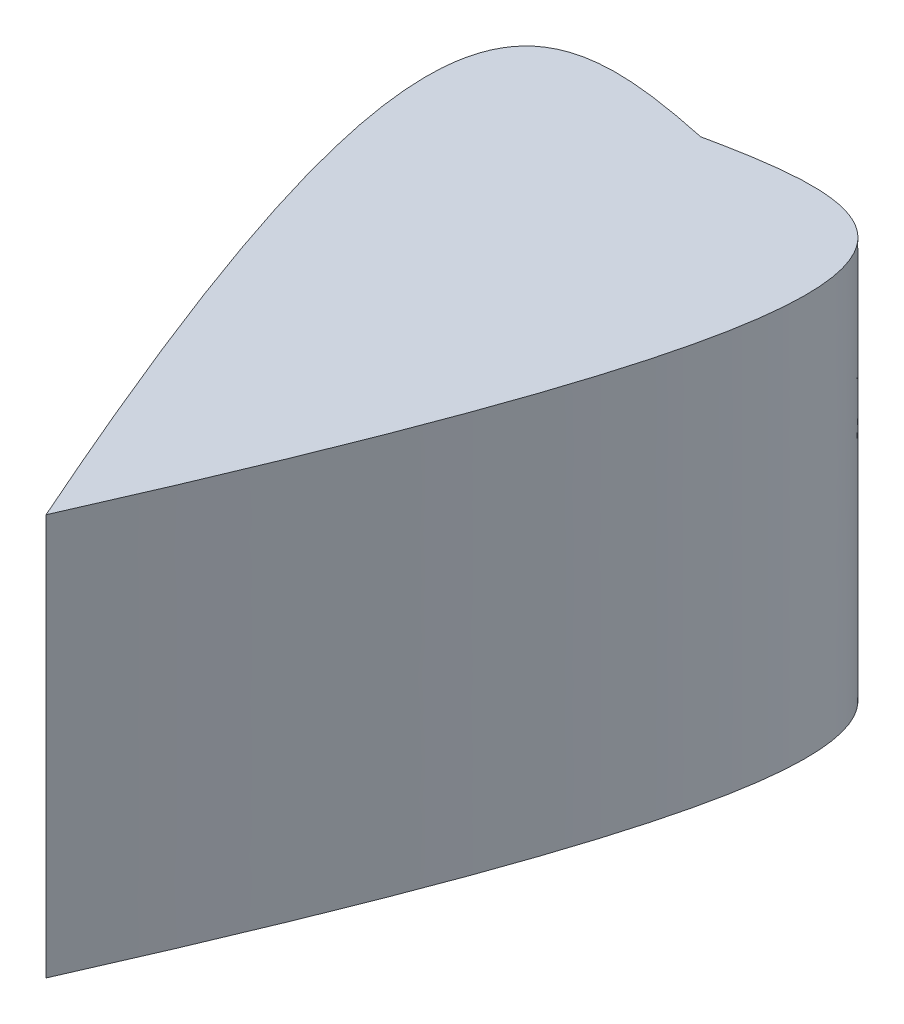
ISO-10303-21;
HEADER;
FILE_DESCRIPTION(('STEP AP214'),'2;1');
FILE_NAME('part.step','',(''),(''),'','','');
FILE_SCHEMA(('AUTOMOTIVE_DESIGN { 1 0 10303 214 1 1 1 1 }'));
ENDSEC;
DATA;
#1=APPLICATION_CONTEXT('core data for automotive mechanical design processes');
#2=APPLICATION_PROTOCOL_DEFINITION('international standard','automotive_design',2000,#1);
#3=PRODUCT_CONTEXT('',#1,'mechanical');
#4=PRODUCT('Part','Part','',(#3));
#5=PRODUCT_RELATED_PRODUCT_CATEGORY('part','',(#4));
#6=PRODUCT_DEFINITION_FORMATION('','',#4);
#7=PRODUCT_DEFINITION_CONTEXT('part definition',#1,'design');
#8=PRODUCT_DEFINITION('design','',#6,#7);
#9=PRODUCT_DEFINITION_SHAPE('','',#8);
#10=(LENGTH_UNIT() NAMED_UNIT(*) SI_UNIT(.MILLI.,.METRE.));
#11=(NAMED_UNIT(*) PLANE_ANGLE_UNIT() SI_UNIT($,.RADIAN.));
#12=(NAMED_UNIT(*) SI_UNIT($,.STERADIAN.) SOLID_ANGLE_UNIT());
#13=UNCERTAINTY_MEASURE_WITH_UNIT(LENGTH_MEASURE(1.E-05),#10,'distance_accuracy_value','');
#14=(GEOMETRIC_REPRESENTATION_CONTEXT(3) GLOBAL_UNCERTAINTY_ASSIGNED_CONTEXT((#13)) GLOBAL_UNIT_ASSIGNED_CONTEXT((#10,
#11,#12)) REPRESENTATION_CONTEXT('',''));
#15=CARTESIAN_POINT('',(0.,0.,0.));
#16=DIRECTION('',(0.,0.,1.));
#17=DIRECTION('',(1.,0.,0.));
#18=AXIS2_PLACEMENT_3D('',#15,#16,#17);
#19=CARTESIAN_POINT('',(127.864614933596,1007.76905578339,1926.66056876298));
#20=CARTESIAN_POINT('',(-74.2746646403005,1007.76905578339,1883.7763724246));
#21=CARTESIAN_POINT('',(-169.46139322895,1007.76905578339,1907.41005327295));
#22=CARTESIAN_POINT('',(127.864614933596,1007.76905578339,2579.34949617285));
#23=B_SPLINE_CURVE_WITH_KNOTS('',3,(#19,#20,#21,#22),.UNSPECIFIED.,.F.,.F.,(4,4),(0.,1.),.UNSPECIFIED.);
#24=DIRECTION('',(0.,-1.,0.));
#25=VECTOR('',#24,1.);
#26=SURFACE_OF_LINEAR_EXTRUSION('',#23,#25);
#27=CARTESIAN_POINT('',(127.864614933596,607.769055783391,1926.66056876298));
#28=CARTESIAN_POINT('',(-74.2746646403005,607.769055783391,1883.7763724246));
#29=CARTESIAN_POINT('',(-169.46139322895,607.769055783391,1907.41005327295));
#30=CARTESIAN_POINT('',(127.864614933596,607.769055783391,2579.34949617285));
#31=B_SPLINE_CURVE_WITH_KNOTS('',3,(#27,#28,#29,#30),.UNSPECIFIED.,.F.,.F.,(4,4),(0.,1.),.UNSPECIFIED.);
#32=CARTESIAN_POINT('',(127.864614933596,607.769055783391,1926.66056876298));
#33=VERTEX_POINT('',#32);
#34=CARTESIAN_POINT('',(127.864614933596,607.769055783391,2579.34949617285));
#35=VERTEX_POINT('',#34);
#36=EDGE_CURVE('E69',#33,#35,#31,.T.);
#37=ORIENTED_EDGE('',*,*,#36,.T.);
#38=DIRECTION('',(0.,-1.,0.));
#39=VECTOR('',#38,1.);
#40=CARTESIAN_POINT('',(127.864614933596,1007.76905578339,2579.34949617285));
#41=LINE('',#40,#39);
#42=CARTESIAN_POINT('',(127.864614933596,1007.76905578339,2579.34949617285));
#43=VERTEX_POINT('',#42);
#44=EDGE_CURVE('E11',#43,#35,#41,.T.);
#45=ORIENTED_EDGE('',*,*,#44,.F.);
#46=CARTESIAN_POINT('',(127.864614933596,1007.76905578339,1926.66056876298));
#47=VERTEX_POINT('',#46);
#48=EDGE_CURVE('E68',#47,#43,#23,.T.);
#49=ORIENTED_EDGE('',*,*,#48,.F.);
#50=DIRECTION('',(0.,-1.,0.));
#51=VECTOR('',#50,1.);
#52=CARTESIAN_POINT('',(127.864614933596,1007.76905578339,1926.66056876298));
#53=LINE('',#52,#51);
#54=EDGE_CURVE('E46',#47,#33,#53,.T.);
#55=ORIENTED_EDGE('',*,*,#54,.T.);
#56=EDGE_LOOP('',(#37,#45,#49,#55));
#57=FACE_BOUND('',#56,.T.);
#58=ADVANCED_FACE('F37',(#57),#26,.F.);
#59=CARTESIAN_POINT('',(127.864614933596,1007.76905578339,2579.34949617285));
#60=CARTESIAN_POINT('',(425.190623096143,1007.76905578339,1907.41005327295));
#61=CARTESIAN_POINT('',(330.003894507493,1007.76905578339,1883.7763724246));
#62=CARTESIAN_POINT('',(127.864614933596,1007.76905578339,1926.66056876298));
#63=B_SPLINE_CURVE_WITH_KNOTS('',3,(#59,#60,#61,#62),.UNSPECIFIED.,.F.,.F.,(4,4),(0.,1.),.UNSPECIFIED.);
#64=DIRECTION('',(0.,-1.,0.));
#65=VECTOR('',#64,1.);
#66=SURFACE_OF_LINEAR_EXTRUSION('',#63,#65);
#67=CARTESIAN_POINT('',(127.864614933596,607.769055783391,2579.34949617285));
#68=CARTESIAN_POINT('',(425.190623096143,607.769055783391,1907.41005327295));
#69=CARTESIAN_POINT('',(330.003894507493,607.769055783391,1883.7763724246));
#70=CARTESIAN_POINT('',(127.864614933596,607.769055783391,1926.66056876298));
#71=B_SPLINE_CURVE_WITH_KNOTS('',3,(#67,#68,#69,#70),.UNSPECIFIED.,.F.,.F.,(4,4),(0.,1.),.UNSPECIFIED.);
#72=EDGE_CURVE('E61',#35,#33,#71,.T.);
#73=ORIENTED_EDGE('',*,*,#72,.T.);
#74=ORIENTED_EDGE('',*,*,#54,.F.);
#75=EDGE_CURVE('E53',#43,#47,#63,.T.);
#76=ORIENTED_EDGE('',*,*,#75,.F.);
#77=ORIENTED_EDGE('',*,*,#44,.T.);
#78=EDGE_LOOP('',(#73,#74,#76,#77));
#79=FACE_BOUND('',#78,.T.);
#80=ADVANCED_FACE('F64',(#79),#66,.F.);
#81=CARTESIAN_POINT('',(-59.4348679675698,1007.76905578339,1984.94616775356));
#82=DIRECTION('',(0.,-1.,0.));
#83=DIRECTION('',(0.,0.,-1.));
#84=AXIS2_PLACEMENT_3D('',#81,#82,#83);
#85=PLANE('',#84);
#86=ORIENTED_EDGE('',*,*,#48,.T.);
#87=ORIENTED_EDGE('',*,*,#75,.T.);
#88=EDGE_LOOP('',(#86,#87));
#89=FACE_BOUND('',#88,.T.);
#90=ADVANCED_FACE('F96',(#89),#85,.F.);
#91=CARTESIAN_POINT('',(-59.4348679675698,607.769055783391,1984.94616775356));
#92=DIRECTION('',(0.,-1.,0.));
#93=DIRECTION('',(0.,0.,-1.));
#94=AXIS2_PLACEMENT_3D('',#91,#92,#93);
#95=PLANE('',#94);
#96=ORIENTED_EDGE('',*,*,#36,.F.);
#97=ORIENTED_EDGE('',*,*,#72,.F.);
#98=EDGE_LOOP('',(#96,#97));
#99=FACE_BOUND('',#98,.T.);
#100=ADVANCED_FACE('F72',(#99),#95,.T.);
#101=CLOSED_SHELL('',(#58,#80,#90,#100));
#102=MANIFOLD_SOLID_BREP('B2',#101);
#103=ADVANCED_BREP_SHAPE_REPRESENTATION('',(#18,#102),#14);
#104=SHAPE_DEFINITION_REPRESENTATION(#9,#103);
ENDSEC;
END-ISO-10303-21;
